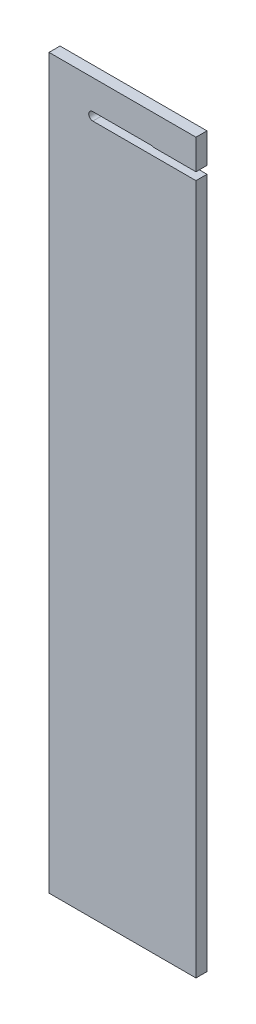
ISO-10303-21;
HEADER;
FILE_DESCRIPTION(('STEP AP214'),'2;1');
FILE_NAME('part.step','',(''),(''),'','','');
FILE_SCHEMA(('AUTOMOTIVE_DESIGN { 1 0 10303 214 1 1 1 1 }'));
ENDSEC;
DATA;
#1=APPLICATION_CONTEXT('core data for automotive mechanical design processes');
#2=APPLICATION_PROTOCOL_DEFINITION('international standard','automotive_design',2000,#1);
#3=PRODUCT_CONTEXT('',#1,'mechanical');
#4=PRODUCT('Part','Part','',(#3));
#5=PRODUCT_RELATED_PRODUCT_CATEGORY('part','',(#4));
#6=PRODUCT_DEFINITION_FORMATION('','',#4);
#7=PRODUCT_DEFINITION_CONTEXT('part definition',#1,'design');
#8=PRODUCT_DEFINITION('design','',#6,#7);
#9=PRODUCT_DEFINITION_SHAPE('','',#8);
#10=(LENGTH_UNIT() NAMED_UNIT(*) SI_UNIT(.MILLI.,.METRE.));
#11=(NAMED_UNIT(*) PLANE_ANGLE_UNIT() SI_UNIT($,.RADIAN.));
#12=(NAMED_UNIT(*) SI_UNIT($,.STERADIAN.) SOLID_ANGLE_UNIT());
#13=UNCERTAINTY_MEASURE_WITH_UNIT(LENGTH_MEASURE(1.E-05),#10,'distance_accuracy_value','');
#14=(GEOMETRIC_REPRESENTATION_CONTEXT(3) GLOBAL_UNCERTAINTY_ASSIGNED_CONTEXT((#13)) GLOBAL_UNIT_ASSIGNED_CONTEXT((#10,
#11,#12)) REPRESENTATION_CONTEXT('',''));
#15=CARTESIAN_POINT('',(0.,0.,0.));
#16=DIRECTION('',(0.,0.,1.));
#17=DIRECTION('',(1.,0.,0.));
#18=AXIS2_PLACEMENT_3D('',#15,#16,#17);
#19=CARTESIAN_POINT('',(31.75,0.,4.7625));
#20=DIRECTION('',(1.,0.,0.));
#21=DIRECTION('',(0.,0.,-1.));
#22=AXIS2_PLACEMENT_3D('',#19,#20,#21);
#23=PLANE('',#22);
#24=DIRECTION('',(0.,-1.,0.));
#25=VECTOR('',#24,1.);
#26=CARTESIAN_POINT('',(31.75,0.,0.));
#27=LINE('',#26,#25);
#28=CARTESIAN_POINT('',(31.75,149.225,0.));
#29=VERTEX_POINT('',#28);
#30=CARTESIAN_POINT('',(31.75,-149.225,0.));
#31=VERTEX_POINT('',#30);
#32=EDGE_CURVE('E116',#29,#31,#27,.T.);
#33=ORIENTED_EDGE('',*,*,#32,.F.);
#34=DIRECTION('',(0.,0.,-1.));
#35=VECTOR('',#34,1.);
#36=CARTESIAN_POINT('',(31.75,149.225,4.7625));
#37=LINE('',#36,#35);
#38=CARTESIAN_POINT('',(31.75,149.225,4.7625));
#39=VERTEX_POINT('',#38);
#40=EDGE_CURVE('E112',#39,#29,#37,.T.);
#41=ORIENTED_EDGE('',*,*,#40,.F.);
#42=DIRECTION('',(0.,-1.,0.));
#43=VECTOR('',#42,1.);
#44=CARTESIAN_POINT('',(31.75,0.,4.7625));
#45=LINE('',#44,#43);
#46=CARTESIAN_POINT('',(31.75,-149.225,4.7625));
#47=VERTEX_POINT('',#46);
#48=EDGE_CURVE('E114',#39,#47,#45,.T.);
#49=ORIENTED_EDGE('',*,*,#48,.T.);
#50=DIRECTION('',(0.,0.,-1.));
#51=VECTOR('',#50,1.);
#52=CARTESIAN_POINT('',(31.75,-149.225,4.7625));
#53=LINE('',#52,#51);
#54=EDGE_CURVE('E152',#47,#31,#53,.T.);
#55=ORIENTED_EDGE('',*,*,#54,.T.);
#56=EDGE_LOOP('',(#33,#41,#49,#55));
#57=FACE_BOUND('',#56,.T.);
#58=ADVANCED_FACE('F35',(#57),#23,.T.);
#59=CARTESIAN_POINT('',(0.,149.225,4.7625));
#60=DIRECTION('',(0.,1.,0.));
#61=DIRECTION('',(0.,0.,1.));
#62=AXIS2_PLACEMENT_3D('',#59,#60,#61);
#63=PLANE('',#62);
#64=DIRECTION('',(1.,0.,0.));
#65=VECTOR('',#64,1.);
#66=CARTESIAN_POINT('',(0.,149.225,0.));
#67=LINE('',#66,#65);
#68=CARTESIAN_POINT('',(-12.827,149.225,0.));
#69=VERTEX_POINT('',#68);
#70=EDGE_CURVE('E154',#69,#29,#67,.T.);
#71=ORIENTED_EDGE('',*,*,#70,.F.);
#72=DIRECTION('',(0.,0.,-1.));
#73=VECTOR('',#72,1.);
#74=CARTESIAN_POINT('',(-12.827,149.225,4.7625));
#75=LINE('',#74,#73);
#76=CARTESIAN_POINT('',(-12.827,149.225,4.7625));
#77=VERTEX_POINT('',#76);
#78=EDGE_CURVE('E122',#77,#69,#75,.T.);
#79=ORIENTED_EDGE('',*,*,#78,.F.);
#80=DIRECTION('',(1.,0.,0.));
#81=VECTOR('',#80,1.);
#82=CARTESIAN_POINT('',(0.,149.225,4.7625));
#83=LINE('',#82,#81);
#84=EDGE_CURVE('E127',#77,#39,#83,.T.);
#85=ORIENTED_EDGE('',*,*,#84,.T.);
#86=ORIENTED_EDGE('',*,*,#40,.T.);
#87=EDGE_LOOP('',(#71,#79,#85,#86));
#88=FACE_BOUND('',#87,.T.);
#89=ADVANCED_FACE('F134',(#88),#63,.T.);
#90=CARTESIAN_POINT('',(-12.827,151.003,4.7625));
#91=DIRECTION('',(0.,0.,-1.));
#92=DIRECTION('',(-1.,0.,0.));
#93=AXIS2_PLACEMENT_3D('',#90,#91,#92);
#94=CYLINDRICAL_SURFACE('',#93,1.778);
#95=CARTESIAN_POINT('',(-12.827,151.003,0.));
#96=DIRECTION('',(0.,0.,1.));
#97=DIRECTION('',(1.,0.,0.));
#98=AXIS2_PLACEMENT_3D('',#95,#96,#97);
#99=CIRCLE('',#98,1.778);
#100=CARTESIAN_POINT('',(-12.827,152.781,0.));
#101=VERTEX_POINT('',#100);
#102=EDGE_CURVE('E156',#101,#69,#99,.T.);
#103=ORIENTED_EDGE('',*,*,#102,.F.);
#104=DIRECTION('',(0.,0.,-1.));
#105=VECTOR('',#104,1.);
#106=CARTESIAN_POINT('',(-12.827,152.781,4.7625));
#107=LINE('',#106,#105);
#108=CARTESIAN_POINT('',(-12.827,152.781,4.7625));
#109=VERTEX_POINT('',#108);
#110=EDGE_CURVE('E187',#109,#101,#107,.T.);
#111=ORIENTED_EDGE('',*,*,#110,.F.);
#112=CARTESIAN_POINT('',(-12.827,151.003,4.7625));
#113=DIRECTION('',(0.,0.,1.));
#114=DIRECTION('',(1.,0.,0.));
#115=AXIS2_PLACEMENT_3D('',#112,#113,#114);
#116=CIRCLE('',#115,1.778);
#117=EDGE_CURVE('E135',#109,#77,#116,.T.);
#118=ORIENTED_EDGE('',*,*,#117,.T.);
#119=ORIENTED_EDGE('',*,*,#78,.T.);
#120=EDGE_LOOP('',(#103,#111,#118,#119));
#121=FACE_BOUND('',#120,.T.);
#122=ADVANCED_FACE('F217',(#121),#94,.F.);
#123=CARTESIAN_POINT('',(0.,152.781,4.7625));
#124=DIRECTION('',(0.,-1.,0.));
#125=DIRECTION('',(0.,0.,-1.));
#126=AXIS2_PLACEMENT_3D('',#123,#124,#125);
#127=PLANE('',#126);
#128=DIRECTION('',(-1.,0.,0.));
#129=VECTOR('',#128,1.);
#130=CARTESIAN_POINT('',(0.,152.781,0.));
#131=LINE('',#130,#129);
#132=CARTESIAN_POINT('',(12.827,152.781,0.));
#133=VERTEX_POINT('',#132);
#134=EDGE_CURVE('E159',#133,#101,#131,.T.);
#135=ORIENTED_EDGE('',*,*,#134,.F.);
#136=DIRECTION('',(0.,0.,-1.));
#137=VECTOR('',#136,1.);
#138=CARTESIAN_POINT('',(12.827,152.781,4.7625));
#139=LINE('',#138,#137);
#140=CARTESIAN_POINT('',(12.827,152.781,4.7625));
#141=VERTEX_POINT('',#140);
#142=EDGE_CURVE('E185',#141,#133,#139,.T.);
#143=ORIENTED_EDGE('',*,*,#142,.F.);
#144=DIRECTION('',(-1.,0.,0.));
#145=VECTOR('',#144,1.);
#146=CARTESIAN_POINT('',(0.,152.781,4.7625));
#147=LINE('',#146,#145);
#148=EDGE_CURVE('E137',#141,#109,#147,.T.);
#149=ORIENTED_EDGE('',*,*,#148,.T.);
#150=ORIENTED_EDGE('',*,*,#110,.T.);
#151=EDGE_LOOP('',(#135,#143,#149,#150));
#152=FACE_BOUND('',#151,.T.);
#153=ADVANCED_FACE('F196',(#152),#127,.T.);
#154=CARTESIAN_POINT('',(0.,152.527,4.7625));
#155=DIRECTION('',(0.,-1.,0.));
#156=DIRECTION('',(0.,0.,-1.));
#157=AXIS2_PLACEMENT_3D('',#154,#155,#156);
#158=PLANE('',#157);
#159=DIRECTION('',(-1.,0.,0.));
#160=VECTOR('',#159,1.);
#161=CARTESIAN_POINT('',(0.,152.527,4.7625));
#162=LINE('',#161,#160);
#163=CARTESIAN_POINT('',(31.75,152.527,4.7625));
#164=VERTEX_POINT('',#163);
#165=CARTESIAN_POINT('',(14.0713407893338,152.527,4.7625));
#166=VERTEX_POINT('',#165);
#167=EDGE_CURVE('E142',#164,#166,#162,.T.);
#168=ORIENTED_EDGE('',*,*,#167,.T.);
#169=DIRECTION('',(0.,0.,-1.));
#170=VECTOR('',#169,1.);
#171=CARTESIAN_POINT('',(14.0713407893338,152.527,0.));
#172=LINE('',#171,#170);
#173=CARTESIAN_POINT('',(14.0713407893338,152.527,0.));
#174=VERTEX_POINT('',#173);
#175=EDGE_CURVE('E121',#166,#174,#172,.T.);
#176=ORIENTED_EDGE('',*,*,#175,.T.);
#177=DIRECTION('',(-1.,0.,0.));
#178=VECTOR('',#177,1.);
#179=CARTESIAN_POINT('',(0.,152.527,0.));
#180=LINE('',#179,#178);
#181=CARTESIAN_POINT('',(31.75,152.527,0.));
#182=VERTEX_POINT('',#181);
#183=EDGE_CURVE('E162',#182,#174,#180,.T.);
#184=ORIENTED_EDGE('',*,*,#183,.F.);
#185=DIRECTION('',(0.,0.,-1.));
#186=VECTOR('',#185,1.);
#187=CARTESIAN_POINT('',(31.75,152.527,4.7625));
#188=LINE('',#187,#186);
#189=EDGE_CURVE('E183',#164,#182,#188,.T.);
#190=ORIENTED_EDGE('',*,*,#189,.F.);
#191=EDGE_LOOP('',(#168,#176,#184,#190));
#192=FACE_BOUND('',#191,.T.);
#193=ADVANCED_FACE('F199',(#192),#158,.T.);
#194=CARTESIAN_POINT('',(31.75,0.,4.7625));
#195=DIRECTION('',(-1.,0.,0.));
#196=DIRECTION('',(0.,0.,1.));
#197=AXIS2_PLACEMENT_3D('',#194,#195,#196);
#198=PLANE('',#197);
#199=DIRECTION('',(0.,1.,0.));
#200=VECTOR('',#199,1.);
#201=CARTESIAN_POINT('',(31.75,0.,0.));
#202=LINE('',#201,#200);
#203=CARTESIAN_POINT('',(31.75,165.481,0.));
#204=VERTEX_POINT('',#203);
#205=EDGE_CURVE('E165',#182,#204,#202,.T.);
#206=ORIENTED_EDGE('',*,*,#205,.T.);
#207=DIRECTION('',(0.,0.,-1.));
#208=VECTOR('',#207,1.);
#209=CARTESIAN_POINT('',(31.75,165.481,4.7625));
#210=LINE('',#209,#208);
#211=CARTESIAN_POINT('',(31.75,165.481,4.7625));
#212=VERTEX_POINT('',#211);
#213=EDGE_CURVE('E181',#212,#204,#210,.T.);
#214=ORIENTED_EDGE('',*,*,#213,.F.);
#215=DIRECTION('',(0.,1.,0.));
#216=VECTOR('',#215,1.);
#217=CARTESIAN_POINT('',(31.75,0.,4.7625));
#218=LINE('',#217,#216);
#219=EDGE_CURVE('E144',#164,#212,#218,.T.);
#220=ORIENTED_EDGE('',*,*,#219,.F.);
#221=ORIENTED_EDGE('',*,*,#189,.T.);
#222=EDGE_LOOP('',(#206,#214,#220,#221));
#223=FACE_BOUND('',#222,.T.);
#224=ADVANCED_FACE('F204',(#223),#198,.F.);
#225=CARTESIAN_POINT('',(0.,165.481,4.7625));
#226=DIRECTION('',(0.,1.,0.));
#227=DIRECTION('',(0.,0.,1.));
#228=AXIS2_PLACEMENT_3D('',#225,#226,#227);
#229=PLANE('',#228);
#230=DIRECTION('',(1.,0.,0.));
#231=VECTOR('',#230,1.);
#232=CARTESIAN_POINT('',(0.,165.481,0.));
#233=LINE('',#232,#231);
#234=CARTESIAN_POINT('',(-31.75,165.481,0.));
#235=VERTEX_POINT('',#234);
#236=EDGE_CURVE('E168',#235,#204,#233,.T.);
#237=ORIENTED_EDGE('',*,*,#236,.F.);
#238=DIRECTION('',(0.,0.,-1.));
#239=VECTOR('',#238,1.);
#240=CARTESIAN_POINT('',(-31.75,165.481,4.7625));
#241=LINE('',#240,#239);
#242=CARTESIAN_POINT('',(-31.75,165.481,4.7625));
#243=VERTEX_POINT('',#242);
#244=EDGE_CURVE('E179',#243,#235,#241,.T.);
#245=ORIENTED_EDGE('',*,*,#244,.F.);
#246=DIRECTION('',(1.,0.,0.));
#247=VECTOR('',#246,1.);
#248=CARTESIAN_POINT('',(0.,165.481,4.7625));
#249=LINE('',#248,#247);
#250=EDGE_CURVE('E146',#243,#212,#249,.T.);
#251=ORIENTED_EDGE('',*,*,#250,.T.);
#252=ORIENTED_EDGE('',*,*,#213,.T.);
#253=EDGE_LOOP('',(#237,#245,#251,#252));
#254=FACE_BOUND('',#253,.T.);
#255=ADVANCED_FACE('F207',(#254),#229,.T.);
#256=CARTESIAN_POINT('',(-31.75,0.,4.7625));
#257=DIRECTION('',(1.,0.,0.));
#258=DIRECTION('',(0.,0.,-1.));
#259=AXIS2_PLACEMENT_3D('',#256,#257,#258);
#260=PLANE('',#259);
#261=DIRECTION('',(0.,-1.,0.));
#262=VECTOR('',#261,1.);
#263=CARTESIAN_POINT('',(-31.75,0.,0.));
#264=LINE('',#263,#262);
#265=CARTESIAN_POINT('',(-31.75,-149.225,0.));
#266=VERTEX_POINT('',#265);
#267=EDGE_CURVE('E171',#235,#266,#264,.T.);
#268=ORIENTED_EDGE('',*,*,#267,.T.);
#269=DIRECTION('',(0.,0.,-1.));
#270=VECTOR('',#269,1.);
#271=CARTESIAN_POINT('',(-31.75,-149.225,4.7625));
#272=LINE('',#271,#270);
#273=CARTESIAN_POINT('',(-31.75,-149.225,4.7625));
#274=VERTEX_POINT('',#273);
#275=EDGE_CURVE('E176',#274,#266,#272,.T.);
#276=ORIENTED_EDGE('',*,*,#275,.F.);
#277=DIRECTION('',(0.,-1.,0.));
#278=VECTOR('',#277,1.);
#279=CARTESIAN_POINT('',(-31.75,0.,4.7625));
#280=LINE('',#279,#278);
#281=EDGE_CURVE('E149',#243,#274,#280,.T.);
#282=ORIENTED_EDGE('',*,*,#281,.F.);
#283=ORIENTED_EDGE('',*,*,#244,.T.);
#284=EDGE_LOOP('',(#268,#276,#282,#283));
#285=FACE_BOUND('',#284,.T.);
#286=ADVANCED_FACE('F212',(#285),#260,.F.);
#287=CARTESIAN_POINT('',(0.,-149.225,4.7625));
#288=DIRECTION('',(0.,1.,0.));
#289=DIRECTION('',(0.,0.,1.));
#290=AXIS2_PLACEMENT_3D('',#287,#288,#289);
#291=PLANE('',#290);
#292=DIRECTION('',(1.,0.,0.));
#293=VECTOR('',#292,1.);
#294=CARTESIAN_POINT('',(0.,-149.225,0.));
#295=LINE('',#294,#293);
#296=EDGE_CURVE('E132',#266,#31,#295,.T.);
#297=ORIENTED_EDGE('',*,*,#296,.T.);
#298=ORIENTED_EDGE('',*,*,#54,.F.);
#299=DIRECTION('',(1.,0.,0.));
#300=VECTOR('',#299,1.);
#301=CARTESIAN_POINT('',(0.,-149.225,4.7625));
#302=LINE('',#301,#300);
#303=EDGE_CURVE('E130',#274,#47,#302,.T.);
#304=ORIENTED_EDGE('',*,*,#303,.F.);
#305=ORIENTED_EDGE('',*,*,#275,.T.);
#306=EDGE_LOOP('',(#297,#298,#304,#305));
#307=FACE_BOUND('',#306,.T.);
#308=ADVANCED_FACE('F215',(#307),#291,.F.);
#309=CARTESIAN_POINT('',(0.,0.,4.7625));
#310=DIRECTION('',(0.,0.,1.));
#311=DIRECTION('',(1.,0.,0.));
#312=AXIS2_PLACEMENT_3D('',#309,#310,#311);
#313=PLANE('',#312);
#314=ORIENTED_EDGE('',*,*,#148,.F.);
#315=CARTESIAN_POINT('',(14.0713407893338,155.702,4.7625));
#316=DIRECTION('',(0.,0.,1.));
#317=DIRECTION('',(1.,0.,0.));
#318=AXIS2_PLACEMENT_3D('',#315,#316,#317);
#319=CIRCLE('',#318,3.175);
#320=EDGE_CURVE('E11',#141,#166,#319,.T.);
#321=ORIENTED_EDGE('',*,*,#320,.T.);
#322=ORIENTED_EDGE('',*,*,#167,.F.);
#323=ORIENTED_EDGE('',*,*,#219,.T.);
#324=ORIENTED_EDGE('',*,*,#250,.F.);
#325=ORIENTED_EDGE('',*,*,#281,.T.);
#326=ORIENTED_EDGE('',*,*,#303,.T.);
#327=ORIENTED_EDGE('',*,*,#48,.F.);
#328=ORIENTED_EDGE('',*,*,#84,.F.);
#329=ORIENTED_EDGE('',*,*,#117,.F.);
#330=EDGE_LOOP('',(#314,#321,#322,#323,#324,#325,#326,#327,#328,#329));
#331=FACE_BOUND('',#330,.T.);
#332=ADVANCED_FACE('F125',(#331),#313,.T.);
#333=CARTESIAN_POINT('',(0.,0.,0.));
#334=DIRECTION('',(0.,0.,1.));
#335=DIRECTION('',(1.,0.,0.));
#336=AXIS2_PLACEMENT_3D('',#333,#334,#335);
#337=PLANE('',#336);
#338=ORIENTED_EDGE('',*,*,#183,.T.);
#339=CARTESIAN_POINT('',(14.0713407893338,155.702,0.));
#340=DIRECTION('',(0.,0.,1.));
#341=DIRECTION('',(1.,0.,0.));
#342=AXIS2_PLACEMENT_3D('',#339,#340,#341);
#343=CIRCLE('',#342,3.175);
#344=EDGE_CURVE('E43',#174,#133,#343,.F.);
#345=ORIENTED_EDGE('',*,*,#344,.T.);
#346=ORIENTED_EDGE('',*,*,#134,.T.);
#347=ORIENTED_EDGE('',*,*,#102,.T.);
#348=ORIENTED_EDGE('',*,*,#70,.T.);
#349=ORIENTED_EDGE('',*,*,#32,.T.);
#350=ORIENTED_EDGE('',*,*,#296,.F.);
#351=ORIENTED_EDGE('',*,*,#267,.F.);
#352=ORIENTED_EDGE('',*,*,#236,.T.);
#353=ORIENTED_EDGE('',*,*,#205,.F.);
#354=EDGE_LOOP('',(#338,#345,#346,#347,#348,#349,#350,#351,#352,#353));
#355=FACE_BOUND('',#354,.T.);
#356=ADVANCED_FACE('F192',(#355),#337,.F.);
#357=CARTESIAN_POINT('',(14.0713407893338,155.702,4.7625));
#358=DIRECTION('',(0.,0.,1.));
#359=DIRECTION('',(1.,0.,0.));
#360=AXIS2_PLACEMENT_3D('',#357,#358,#359);
#361=CYLINDRICAL_SURFACE('',#360,3.175);
#362=ORIENTED_EDGE('',*,*,#320,.F.);
#363=ORIENTED_EDGE('',*,*,#142,.T.);
#364=ORIENTED_EDGE('',*,*,#344,.F.);
#365=ORIENTED_EDGE('',*,*,#175,.F.);
#366=EDGE_LOOP('',(#362,#363,#364,#365));
#367=FACE_BOUND('',#366,.T.);
#368=ADVANCED_FACE('F37',(#367),#361,.T.);
#369=CLOSED_SHELL('',(#58,#89,#122,#153,#193,#224,#255,#286,#308,#332,#356,#368));
#370=MANIFOLD_SOLID_BREP('B2',#369);
#371=ADVANCED_BREP_SHAPE_REPRESENTATION('',(#18,#370),#14);
#372=SHAPE_DEFINITION_REPRESENTATION(#9,#371);
ENDSEC;
END-ISO-10303-21;
